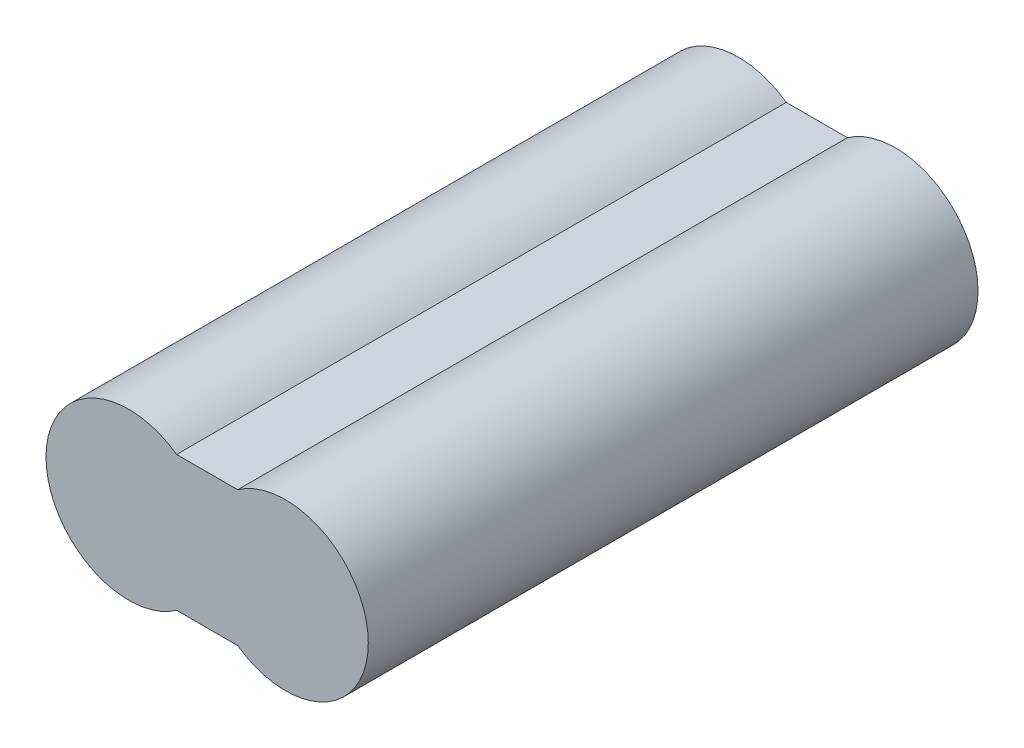
ISO-10303-21;
HEADER;
FILE_DESCRIPTION(('STEP AP214'),'2;1');
FILE_NAME('part.step','',(''),(''),'','','');
FILE_SCHEMA(('AUTOMOTIVE_DESIGN { 1 0 10303 214 1 1 1 1 }'));
ENDSEC;
DATA;
#1=APPLICATION_CONTEXT('core data for automotive mechanical design processes');
#2=APPLICATION_PROTOCOL_DEFINITION('international standard','automotive_design',2000,#1);
#3=PRODUCT_CONTEXT('',#1,'mechanical');
#4=PRODUCT('Part','Part','',(#3));
#5=PRODUCT_RELATED_PRODUCT_CATEGORY('part','',(#4));
#6=PRODUCT_DEFINITION_FORMATION('','',#4);
#7=PRODUCT_DEFINITION_CONTEXT('part definition',#1,'design');
#8=PRODUCT_DEFINITION('design','',#6,#7);
#9=PRODUCT_DEFINITION_SHAPE('','',#8);
#10=(LENGTH_UNIT() NAMED_UNIT(*) SI_UNIT(.MILLI.,.METRE.));
#11=(NAMED_UNIT(*) PLANE_ANGLE_UNIT() SI_UNIT($,.RADIAN.));
#12=(NAMED_UNIT(*) SI_UNIT($,.STERADIAN.) SOLID_ANGLE_UNIT());
#13=UNCERTAINTY_MEASURE_WITH_UNIT(LENGTH_MEASURE(1.E-05),#10,'distance_accuracy_value','');
#14=(GEOMETRIC_REPRESENTATION_CONTEXT(3) GLOBAL_UNCERTAINTY_ASSIGNED_CONTEXT((#13)) GLOBAL_UNIT_ASSIGNED_CONTEXT((#10,
#11,#12)) REPRESENTATION_CONTEXT('',''));
#15=CARTESIAN_POINT('',(0.,0.,0.));
#16=DIRECTION('',(0.,0.,1.));
#17=DIRECTION('',(1.,0.,0.));
#18=AXIS2_PLACEMENT_3D('',#15,#16,#17);
#19=CARTESIAN_POINT('',(18.,0.,-70.));
#20=DIRECTION('',(0.,0.,1.));
#21=DIRECTION('',(1.,0.,0.));
#22=AXIS2_PLACEMENT_3D('',#19,#20,#21);
#23=CYLINDRICAL_SURFACE('',#22,9.5);
#24=DIRECTION('',(0.,0.,1.));
#25=VECTOR('',#24,1.);
#26=CARTESIAN_POINT('',(12.505684756041,-7.75,-87.0120340475486));
#27=LINE('',#26,#25);
#28=CARTESIAN_POINT('',(12.505684756041,-7.75,-70.));
#29=VERTEX_POINT('',#28);
#30=CARTESIAN_POINT('',(12.505684756041,-7.75,0.));
#31=VERTEX_POINT('',#30);
#32=EDGE_CURVE('E106',#29,#31,#27,.T.);
#33=ORIENTED_EDGE('',*,*,#32,.F.);
#34=CARTESIAN_POINT('',(18.,0.,-70.));
#35=DIRECTION('',(0.,0.,1.));
#36=DIRECTION('',(1.,0.,0.));
#37=AXIS2_PLACEMENT_3D('',#34,#35,#36);
#38=CIRCLE('',#37,9.5);
#39=CARTESIAN_POINT('',(12.505684756041,7.75,-70.));
#40=VERTEX_POINT('',#39);
#41=EDGE_CURVE('E52',#29,#40,#38,.T.);
#42=ORIENTED_EDGE('',*,*,#41,.T.);
#43=DIRECTION('',(0.,0.,1.));
#44=VECTOR('',#43,1.);
#45=CARTESIAN_POINT('',(12.505684756041,7.75,-87.0120340475486));
#46=LINE('',#45,#44);
#47=CARTESIAN_POINT('',(12.505684756041,7.75,0.));
#48=VERTEX_POINT('',#47);
#49=EDGE_CURVE('E97',#40,#48,#46,.T.);
#50=ORIENTED_EDGE('',*,*,#49,.T.);
#51=CARTESIAN_POINT('',(18.,0.,0.));
#52=DIRECTION('',(0.,0.,1.));
#53=DIRECTION('',(1.,0.,0.));
#54=AXIS2_PLACEMENT_3D('',#51,#52,#53);
#55=CIRCLE('',#54,9.5);
#56=EDGE_CURVE('E101',#31,#48,#55,.T.);
#57=ORIENTED_EDGE('',*,*,#56,.F.);
#58=EDGE_LOOP('',(#33,#42,#50,#57));
#59=FACE_BOUND('',#58,.T.);
#60=ADVANCED_FACE('F43',(#59),#23,.T.);
#61=CARTESIAN_POINT('',(0.,0.,-70.));
#62=DIRECTION('',(0.,0.,1.));
#63=DIRECTION('',(1.,0.,0.));
#64=AXIS2_PLACEMENT_3D('',#61,#62,#63);
#65=CYLINDRICAL_SURFACE('',#64,9.5);
#66=DIRECTION('',(0.,0.,1.));
#67=VECTOR('',#66,1.);
#68=CARTESIAN_POINT('',(5.49431524395898,-7.75,-87.0120340475486));
#69=LINE('',#68,#67);
#70=CARTESIAN_POINT('',(5.49431524395898,-7.75,-70.));
#71=VERTEX_POINT('',#70);
#72=CARTESIAN_POINT('',(5.49431524395898,-7.75,0.));
#73=VERTEX_POINT('',#72);
#74=EDGE_CURVE('E96',#71,#73,#69,.T.);
#75=ORIENTED_EDGE('',*,*,#74,.T.);
#76=CARTESIAN_POINT('',(0.,0.,0.));
#77=DIRECTION('',(0.,0.,1.));
#78=DIRECTION('',(1.,0.,0.));
#79=AXIS2_PLACEMENT_3D('',#76,#77,#78);
#80=CIRCLE('',#79,9.5);
#81=CARTESIAN_POINT('',(5.49431524395898,7.75,0.));
#82=VERTEX_POINT('',#81);
#83=EDGE_CURVE('E46',#82,#73,#80,.T.);
#84=ORIENTED_EDGE('',*,*,#83,.F.);
#85=DIRECTION('',(0.,0.,1.));
#86=VECTOR('',#85,1.);
#87=CARTESIAN_POINT('',(5.49431524395898,7.75,-87.0120340475486));
#88=LINE('',#87,#86);
#89=CARTESIAN_POINT('',(5.49431524395898,7.75,-70.));
#90=VERTEX_POINT('',#89);
#91=EDGE_CURVE('E89',#90,#82,#88,.T.);
#92=ORIENTED_EDGE('',*,*,#91,.F.);
#93=CARTESIAN_POINT('',(0.,0.,-70.));
#94=DIRECTION('',(0.,0.,1.));
#95=DIRECTION('',(1.,0.,0.));
#96=AXIS2_PLACEMENT_3D('',#93,#94,#95);
#97=CIRCLE('',#96,9.5);
#98=EDGE_CURVE('E11',#90,#71,#97,.T.);
#99=ORIENTED_EDGE('',*,*,#98,.T.);
#100=EDGE_LOOP('',(#75,#84,#92,#99));
#101=FACE_BOUND('',#100,.T.);
#102=ADVANCED_FACE('F90',(#101),#65,.T.);
#103=CARTESIAN_POINT('',(9.,0.,-70.));
#104=DIRECTION('',(0.,0.,1.));
#105=DIRECTION('',(1.,0.,0.));
#106=AXIS2_PLACEMENT_3D('',#103,#104,#105);
#107=PLANE('',#106);
#108=ORIENTED_EDGE('',*,*,#41,.F.);
#109=DIRECTION('',(-1.,0.,0.));
#110=VECTOR('',#109,1.);
#111=CARTESIAN_POINT('',(5.49431524395898,-7.75,-70.));
#112=LINE('',#111,#110);
#113=EDGE_CURVE('E86',#29,#71,#112,.T.);
#114=ORIENTED_EDGE('',*,*,#113,.T.);
#115=ORIENTED_EDGE('',*,*,#98,.F.);
#116=DIRECTION('',(1.,0.,0.));
#117=VECTOR('',#116,1.);
#118=CARTESIAN_POINT('',(5.49431524395898,7.75,-70.));
#119=LINE('',#118,#117);
#120=EDGE_CURVE('E83',#90,#40,#119,.T.);
#121=ORIENTED_EDGE('',*,*,#120,.T.);
#122=EDGE_LOOP('',(#108,#114,#115,#121));
#123=FACE_BOUND('',#122,.T.);
#124=ADVANCED_FACE('F81',(#123),#107,.F.);
#125=CARTESIAN_POINT('',(9.,0.,0.));
#126=DIRECTION('',(0.,0.,1.));
#127=DIRECTION('',(1.,0.,0.));
#128=AXIS2_PLACEMENT_3D('',#125,#126,#127);
#129=PLANE('',#128);
#130=DIRECTION('',(1.,0.,0.));
#131=VECTOR('',#130,1.);
#132=CARTESIAN_POINT('',(5.49431524395898,-7.75,0.));
#133=LINE('',#132,#131);
#134=EDGE_CURVE('E116',#73,#31,#133,.T.);
#135=ORIENTED_EDGE('',*,*,#134,.T.);
#136=ORIENTED_EDGE('',*,*,#56,.T.);
#137=DIRECTION('',(-1.,0.,0.));
#138=VECTOR('',#137,1.);
#139=CARTESIAN_POINT('',(5.49431524395898,7.75,0.));
#140=LINE('',#139,#138);
#141=EDGE_CURVE('E117',#48,#82,#140,.T.);
#142=ORIENTED_EDGE('',*,*,#141,.T.);
#143=ORIENTED_EDGE('',*,*,#83,.T.);
#144=EDGE_LOOP('',(#135,#136,#142,#143));
#145=FACE_BOUND('',#144,.T.);
#146=ADVANCED_FACE('F115',(#145),#129,.T.);
#147=CARTESIAN_POINT('',(5.49431524395898,-7.75,-87.0120340475486));
#148=DIRECTION('',(0.,-1.,0.));
#149=DIRECTION('',(0.,0.,-1.));
#150=AXIS2_PLACEMENT_3D('',#147,#148,#149);
#151=PLANE('',#150);
#152=ORIENTED_EDGE('',*,*,#113,.F.);
#153=ORIENTED_EDGE('',*,*,#32,.T.);
#154=ORIENTED_EDGE('',*,*,#134,.F.);
#155=ORIENTED_EDGE('',*,*,#74,.F.);
#156=EDGE_LOOP('',(#152,#153,#154,#155));
#157=FACE_BOUND('',#156,.T.);
#158=ADVANCED_FACE('F120',(#157),#151,.T.);
#159=CARTESIAN_POINT('',(5.49431524395898,7.75,-87.0120340475486));
#160=DIRECTION('',(0.,1.,0.));
#161=DIRECTION('',(0.,0.,1.));
#162=AXIS2_PLACEMENT_3D('',#159,#160,#161);
#163=PLANE('',#162);
#164=ORIENTED_EDGE('',*,*,#120,.F.);
#165=ORIENTED_EDGE('',*,*,#91,.T.);
#166=ORIENTED_EDGE('',*,*,#141,.F.);
#167=ORIENTED_EDGE('',*,*,#49,.F.);
#168=EDGE_LOOP('',(#164,#165,#166,#167));
#169=FACE_BOUND('',#168,.T.);
#170=ADVANCED_FACE('F99',(#169),#163,.T.);
#171=CLOSED_SHELL('',(#60,#102,#124,#146,#158,#170));
#172=MANIFOLD_SOLID_BREP('B2',#171);
#173=ADVANCED_BREP_SHAPE_REPRESENTATION('',(#18,#172),#14);
#174=SHAPE_DEFINITION_REPRESENTATION(#9,#173);
ENDSEC;
END-ISO-10303-21;
